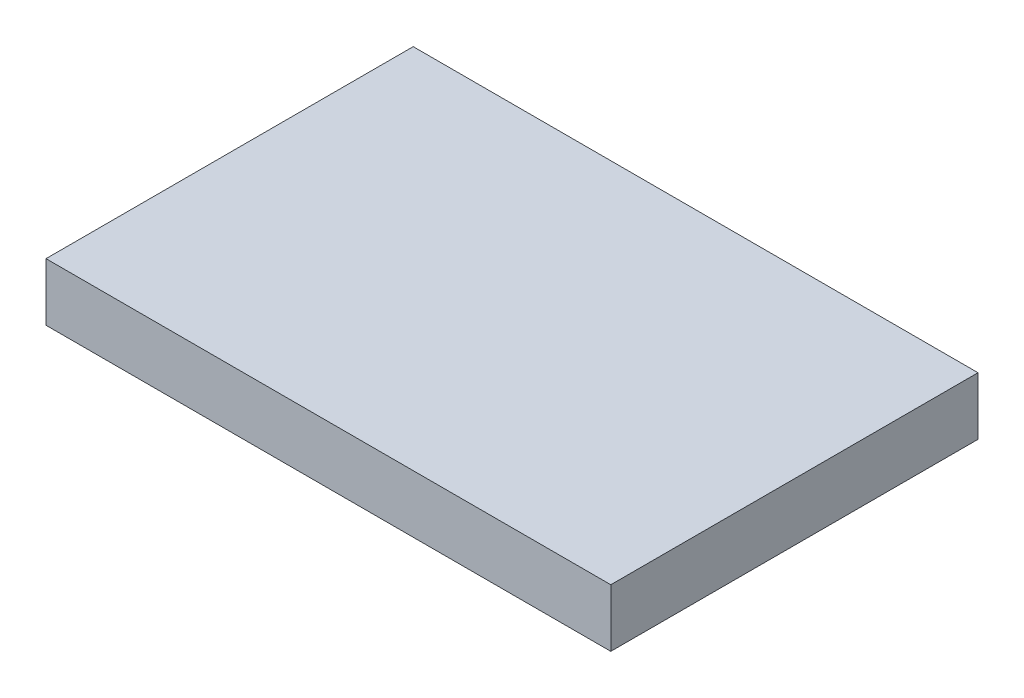
ISO-10303-21;
HEADER;
FILE_DESCRIPTION(('STEP AP214'),'2;1');
FILE_NAME('part.step','',(''),(''),'','','');
FILE_SCHEMA(('AUTOMOTIVE_DESIGN { 1 0 10303 214 1 1 1 1 }'));
ENDSEC;
DATA;
#1=APPLICATION_CONTEXT('core data for automotive mechanical design processes');
#2=APPLICATION_PROTOCOL_DEFINITION('international standard','automotive_design',2000,#1);
#3=PRODUCT_CONTEXT('',#1,'mechanical');
#4=PRODUCT('Part','Part','',(#3));
#5=PRODUCT_RELATED_PRODUCT_CATEGORY('part','',(#4));
#6=PRODUCT_DEFINITION_FORMATION('','',#4);
#7=PRODUCT_DEFINITION_CONTEXT('part definition',#1,'design');
#8=PRODUCT_DEFINITION('design','',#6,#7);
#9=PRODUCT_DEFINITION_SHAPE('','',#8);
#10=(LENGTH_UNIT() NAMED_UNIT(*) SI_UNIT(.MILLI.,.METRE.));
#11=(NAMED_UNIT(*) PLANE_ANGLE_UNIT() SI_UNIT($,.RADIAN.));
#12=(NAMED_UNIT(*) SI_UNIT($,.STERADIAN.) SOLID_ANGLE_UNIT());
#13=UNCERTAINTY_MEASURE_WITH_UNIT(LENGTH_MEASURE(1.E-05),#10,'distance_accuracy_value','');
#14=(GEOMETRIC_REPRESENTATION_CONTEXT(3) GLOBAL_UNCERTAINTY_ASSIGNED_CONTEXT((#13)) GLOBAL_UNIT_ASSIGNED_CONTEXT((#10,
#11,#12)) REPRESENTATION_CONTEXT('',''));
#15=CARTESIAN_POINT('',(0.,0.,0.));
#16=DIRECTION('',(0.,0.,1.));
#17=DIRECTION('',(1.,0.,0.));
#18=AXIS2_PLACEMENT_3D('',#15,#16,#17);
#19=CARTESIAN_POINT('',(0.,8.382,0.));
#20=DIRECTION('',(1.,0.,0.));
#21=DIRECTION('',(0.,0.,-1.));
#22=AXIS2_PLACEMENT_3D('',#19,#20,#21);
#23=PLANE('',#22);
#24=DIRECTION('',(0.,0.,1.));
#25=VECTOR('',#24,1.);
#26=CARTESIAN_POINT('',(0.,0.,0.));
#27=LINE('',#26,#25);
#28=CARTESIAN_POINT('',(0.,0.,0.));
#29=VERTEX_POINT('',#28);
#30=CARTESIAN_POINT('',(0.,0.,53.34));
#31=VERTEX_POINT('',#30);
#32=EDGE_CURVE('E99',#29,#31,#27,.T.);
#33=ORIENTED_EDGE('',*,*,#32,.T.);
#34=DIRECTION('',(0.,-1.,0.));
#35=VECTOR('',#34,1.);
#36=CARTESIAN_POINT('',(0.,8.382,53.34));
#37=LINE('',#36,#35);
#38=CARTESIAN_POINT('',(0.,8.382,53.34));
#39=VERTEX_POINT('',#38);
#40=EDGE_CURVE('E11',#39,#31,#37,.T.);
#41=ORIENTED_EDGE('',*,*,#40,.F.);
#42=DIRECTION('',(0.,0.,1.));
#43=VECTOR('',#42,1.);
#44=CARTESIAN_POINT('',(0.,8.382,0.));
#45=LINE('',#44,#43);
#46=CARTESIAN_POINT('',(0.,8.382,0.));
#47=VERTEX_POINT('',#46);
#48=EDGE_CURVE('E87',#47,#39,#45,.T.);
#49=ORIENTED_EDGE('',*,*,#48,.F.);
#50=DIRECTION('',(0.,-1.,0.));
#51=VECTOR('',#50,1.);
#52=CARTESIAN_POINT('',(0.,8.382,0.));
#53=LINE('',#52,#51);
#54=EDGE_CURVE('E95',#47,#29,#53,.T.);
#55=ORIENTED_EDGE('',*,*,#54,.T.);
#56=EDGE_LOOP('',(#33,#41,#49,#55));
#57=FACE_BOUND('',#56,.T.);
#58=ADVANCED_FACE('F36',(#57),#23,.F.);
#59=CARTESIAN_POINT('',(0.,8.382,53.34));
#60=DIRECTION('',(0.,0.,-1.));
#61=DIRECTION('',(-1.,0.,0.));
#62=AXIS2_PLACEMENT_3D('',#59,#60,#61);
#63=PLANE('',#62);
#64=DIRECTION('',(1.,0.,0.));
#65=VECTOR('',#64,1.);
#66=CARTESIAN_POINT('',(0.,0.,53.34));
#67=LINE('',#66,#65);
#68=CARTESIAN_POINT('',(82.042,0.,53.34));
#69=VERTEX_POINT('',#68);
#70=EDGE_CURVE('E91',#31,#69,#67,.T.);
#71=ORIENTED_EDGE('',*,*,#70,.T.);
#72=DIRECTION('',(0.,-1.,0.));
#73=VECTOR('',#72,1.);
#74=CARTESIAN_POINT('',(82.042,8.382,53.34));
#75=LINE('',#74,#73);
#76=CARTESIAN_POINT('',(82.042,8.382,53.34));
#77=VERTEX_POINT('',#76);
#78=EDGE_CURVE('E44',#77,#69,#75,.T.);
#79=ORIENTED_EDGE('',*,*,#78,.F.);
#80=DIRECTION('',(1.,0.,0.));
#81=VECTOR('',#80,1.);
#82=CARTESIAN_POINT('',(0.,8.382,53.34));
#83=LINE('',#82,#81);
#84=EDGE_CURVE('E82',#39,#77,#83,.T.);
#85=ORIENTED_EDGE('',*,*,#84,.F.);
#86=ORIENTED_EDGE('',*,*,#40,.T.);
#87=EDGE_LOOP('',(#71,#79,#85,#86));
#88=FACE_BOUND('',#87,.T.);
#89=ADVANCED_FACE('F90',(#88),#63,.F.);
#90=CARTESIAN_POINT('',(82.042,8.382,0.));
#91=DIRECTION('',(-1.,0.,0.));
#92=DIRECTION('',(0.,0.,1.));
#93=AXIS2_PLACEMENT_3D('',#90,#91,#92);
#94=PLANE('',#93);
#95=DIRECTION('',(0.,0.,-1.));
#96=VECTOR('',#95,1.);
#97=CARTESIAN_POINT('',(82.042,0.,0.));
#98=LINE('',#97,#96);
#99=CARTESIAN_POINT('',(82.042,0.,0.));
#100=VERTEX_POINT('',#99);
#101=EDGE_CURVE('E69',#69,#100,#98,.T.);
#102=ORIENTED_EDGE('',*,*,#101,.T.);
#103=DIRECTION('',(0.,-1.,0.));
#104=VECTOR('',#103,1.);
#105=CARTESIAN_POINT('',(82.042,8.382,0.));
#106=LINE('',#105,#104);
#107=CARTESIAN_POINT('',(82.042,8.382,0.));
#108=VERTEX_POINT('',#107);
#109=EDGE_CURVE('E92',#108,#100,#106,.T.);
#110=ORIENTED_EDGE('',*,*,#109,.F.);
#111=DIRECTION('',(0.,0.,-1.));
#112=VECTOR('',#111,1.);
#113=CARTESIAN_POINT('',(82.042,8.382,0.));
#114=LINE('',#113,#112);
#115=EDGE_CURVE('E85',#77,#108,#114,.T.);
#116=ORIENTED_EDGE('',*,*,#115,.F.);
#117=ORIENTED_EDGE('',*,*,#78,.T.);
#118=EDGE_LOOP('',(#102,#110,#116,#117));
#119=FACE_BOUND('',#118,.T.);
#120=ADVANCED_FACE('F93',(#119),#94,.F.);
#121=CARTESIAN_POINT('',(0.,8.382,0.));
#122=DIRECTION('',(0.,0.,1.));
#123=DIRECTION('',(1.,0.,0.));
#124=AXIS2_PLACEMENT_3D('',#121,#122,#123);
#125=PLANE('',#124);
#126=DIRECTION('',(-1.,0.,0.));
#127=VECTOR('',#126,1.);
#128=CARTESIAN_POINT('',(0.,0.,0.));
#129=LINE('',#128,#127);
#130=EDGE_CURVE('E75',#100,#29,#129,.T.);
#131=ORIENTED_EDGE('',*,*,#130,.T.);
#132=ORIENTED_EDGE('',*,*,#54,.F.);
#133=DIRECTION('',(-1.,0.,0.));
#134=VECTOR('',#133,1.);
#135=CARTESIAN_POINT('',(0.,8.382,0.));
#136=LINE('',#135,#134);
#137=EDGE_CURVE('E52',#108,#47,#136,.T.);
#138=ORIENTED_EDGE('',*,*,#137,.F.);
#139=ORIENTED_EDGE('',*,*,#109,.T.);
#140=EDGE_LOOP('',(#131,#132,#138,#139));
#141=FACE_BOUND('',#140,.T.);
#142=ADVANCED_FACE('F106',(#141),#125,.F.);
#143=CARTESIAN_POINT('',(0.,8.382,0.));
#144=DIRECTION('',(0.,1.,0.));
#145=DIRECTION('',(0.,0.,1.));
#146=AXIS2_PLACEMENT_3D('',#143,#144,#145);
#147=PLANE('',#146);
#148=ORIENTED_EDGE('',*,*,#48,.T.);
#149=ORIENTED_EDGE('',*,*,#84,.T.);
#150=ORIENTED_EDGE('',*,*,#115,.T.);
#151=ORIENTED_EDGE('',*,*,#137,.T.);
#152=EDGE_LOOP('',(#148,#149,#150,#151));
#153=FACE_BOUND('',#152,.T.);
#154=ADVANCED_FACE('F83',(#153),#147,.T.);
#155=CARTESIAN_POINT('',(0.,0.,0.));
#156=DIRECTION('',(0.,1.,0.));
#157=DIRECTION('',(0.,0.,1.));
#158=AXIS2_PLACEMENT_3D('',#155,#156,#157);
#159=PLANE('',#158);
#160=ORIENTED_EDGE('',*,*,#32,.F.);
#161=ORIENTED_EDGE('',*,*,#130,.F.);
#162=ORIENTED_EDGE('',*,*,#101,.F.);
#163=ORIENTED_EDGE('',*,*,#70,.F.);
#164=EDGE_LOOP('',(#160,#161,#162,#163));
#165=FACE_BOUND('',#164,.T.);
#166=ADVANCED_FACE('F109',(#165),#159,.F.);
#167=CLOSED_SHELL('',(#58,#89,#120,#142,#154,#166));
#168=MANIFOLD_SOLID_BREP('B2',#167);
#169=ADVANCED_BREP_SHAPE_REPRESENTATION('',(#18,#168),#14);
#170=SHAPE_DEFINITION_REPRESENTATION(#9,#169);
ENDSEC;
END-ISO-10303-21;
